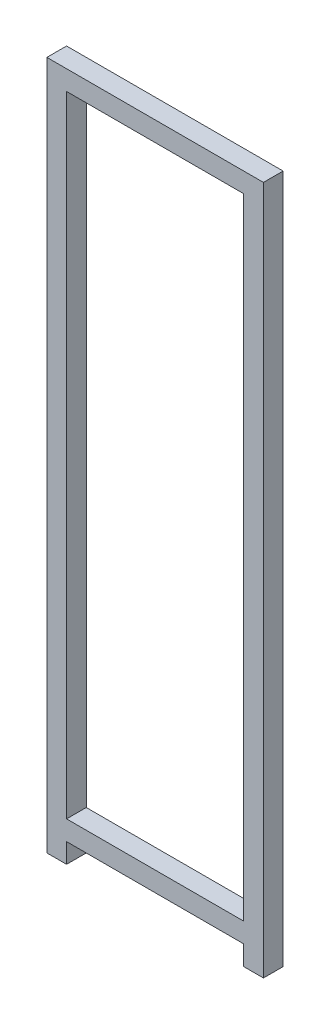
ISO-10303-21;
HEADER;
FILE_DESCRIPTION(('STEP AP214'),'2;1');
FILE_NAME('part.step','',(''),(''),'','','');
FILE_SCHEMA(('AUTOMOTIVE_DESIGN { 1 0 10303 214 1 1 1 1 }'));
ENDSEC;
DATA;
#1=APPLICATION_CONTEXT('core data for automotive mechanical design processes');
#2=APPLICATION_PROTOCOL_DEFINITION('international standard','automotive_design',2000,#1);
#3=PRODUCT_CONTEXT('',#1,'mechanical');
#4=PRODUCT('Part','Part','',(#3));
#5=PRODUCT_RELATED_PRODUCT_CATEGORY('part','',(#4));
#6=PRODUCT_DEFINITION_FORMATION('','',#4);
#7=PRODUCT_DEFINITION_CONTEXT('part definition',#1,'design');
#8=PRODUCT_DEFINITION('design','',#6,#7);
#9=PRODUCT_DEFINITION_SHAPE('','',#8);
#10=(LENGTH_UNIT() NAMED_UNIT(*) SI_UNIT(.MILLI.,.METRE.));
#11=(NAMED_UNIT(*) PLANE_ANGLE_UNIT() SI_UNIT($,.RADIAN.));
#12=(NAMED_UNIT(*) SI_UNIT($,.STERADIAN.) SOLID_ANGLE_UNIT());
#13=UNCERTAINTY_MEASURE_WITH_UNIT(LENGTH_MEASURE(1.E-05),#10,'distance_accuracy_value','');
#14=(GEOMETRIC_REPRESENTATION_CONTEXT(3) GLOBAL_UNCERTAINTY_ASSIGNED_CONTEXT((#13)) GLOBAL_UNIT_ASSIGNED_CONTEXT((#10,
#11,#12)) REPRESENTATION_CONTEXT('',''));
#15=CARTESIAN_POINT('',(0.,0.,0.));
#16=DIRECTION('',(0.,0.,1.));
#17=DIRECTION('',(1.,0.,0.));
#18=AXIS2_PLACEMENT_3D('',#15,#16,#17);
#19=CARTESIAN_POINT('',(-225.,-1500.,-50.));
#20=DIRECTION('',(0.,-1.,0.));
#21=DIRECTION('',(0.,0.,-1.));
#22=AXIS2_PLACEMENT_3D('',#19,#20,#21);
#23=PLANE('',#22);
#24=DIRECTION('',(1.,0.,0.));
#25=VECTOR('',#24,1.);
#26=CARTESIAN_POINT('',(-225.,-1500.,0.));
#27=LINE('',#26,#25);
#28=CARTESIAN_POINT('',(-275.,-1500.,0.));
#29=VERTEX_POINT('',#28);
#30=CARTESIAN_POINT('',(-225.,-1500.,0.));
#31=VERTEX_POINT('',#30);
#32=EDGE_CURVE('E182',#29,#31,#27,.T.);
#33=ORIENTED_EDGE('',*,*,#32,.F.);
#34=DIRECTION('',(0.,0.,1.));
#35=VECTOR('',#34,1.);
#36=CARTESIAN_POINT('',(-275.,-1500.,-50.));
#37=LINE('',#36,#35);
#38=CARTESIAN_POINT('',(-275.,-1500.,-50.));
#39=VERTEX_POINT('',#38);
#40=EDGE_CURVE('E11',#39,#29,#37,.T.);
#41=ORIENTED_EDGE('',*,*,#40,.F.);
#42=DIRECTION('',(1.,0.,0.));
#43=VECTOR('',#42,1.);
#44=CARTESIAN_POINT('',(-225.,-1500.,-50.));
#45=LINE('',#44,#43);
#46=CARTESIAN_POINT('',(-225.,-1500.,-50.));
#47=VERTEX_POINT('',#46);
#48=EDGE_CURVE('E188',#39,#47,#45,.T.);
#49=ORIENTED_EDGE('',*,*,#48,.T.);
#50=DIRECTION('',(0.,0.,1.));
#51=VECTOR('',#50,1.);
#52=CARTESIAN_POINT('',(-225.,-1500.,-50.));
#53=LINE('',#52,#51);
#54=EDGE_CURVE('E52',#47,#31,#53,.T.);
#55=ORIENTED_EDGE('',*,*,#54,.T.);
#56=EDGE_LOOP('',(#33,#41,#49,#55));
#57=FACE_BOUND('',#56,.T.);
#58=ADVANCED_FACE('F49',(#57),#23,.T.);
#59=CARTESIAN_POINT('',(-275.,-1500.,-50.));
#60=DIRECTION('',(-1.,0.,0.));
#61=DIRECTION('',(0.,0.,1.));
#62=AXIS2_PLACEMENT_3D('',#59,#60,#61);
#63=PLANE('',#62);
#64=DIRECTION('',(0.,-1.,0.));
#65=VECTOR('',#64,1.);
#66=CARTESIAN_POINT('',(-275.,-1500.,0.));
#67=LINE('',#66,#65);
#68=CARTESIAN_POINT('',(-275.,250.,0.));
#69=VERTEX_POINT('',#68);
#70=EDGE_CURVE('E193',#69,#29,#67,.T.);
#71=ORIENTED_EDGE('',*,*,#70,.F.);
#72=DIRECTION('',(0.,0.,1.));
#73=VECTOR('',#72,1.);
#74=CARTESIAN_POINT('',(-275.,250.,-50.));
#75=LINE('',#74,#73);
#76=CARTESIAN_POINT('',(-275.,250.,-50.));
#77=VERTEX_POINT('',#76);
#78=EDGE_CURVE('E58',#77,#69,#75,.T.);
#79=ORIENTED_EDGE('',*,*,#78,.F.);
#80=DIRECTION('',(0.,-1.,0.));
#81=VECTOR('',#80,1.);
#82=CARTESIAN_POINT('',(-275.,-1500.,-50.));
#83=LINE('',#82,#81);
#84=EDGE_CURVE('E217',#77,#39,#83,.T.);
#85=ORIENTED_EDGE('',*,*,#84,.T.);
#86=ORIENTED_EDGE('',*,*,#40,.T.);
#87=EDGE_LOOP('',(#71,#79,#85,#86));
#88=FACE_BOUND('',#87,.T.);
#89=ADVANCED_FACE('F280',(#88),#63,.T.);
#90=CARTESIAN_POINT('',(-275.,250.,-50.));
#91=DIRECTION('',(0.,1.,0.));
#92=DIRECTION('',(-1.,0.,0.));
#93=AXIS2_PLACEMENT_3D('',#90,#91,#92);
#94=PLANE('',#93);
#95=DIRECTION('',(-1.,0.,0.));
#96=VECTOR('',#95,1.);
#97=CARTESIAN_POINT('',(-275.,250.,0.));
#98=LINE('',#97,#96);
#99=CARTESIAN_POINT('',(275.,250.,0.));
#100=VERTEX_POINT('',#99);
#101=EDGE_CURVE('E244',#100,#69,#98,.T.);
#102=ORIENTED_EDGE('',*,*,#101,.F.);
#103=DIRECTION('',(0.,0.,1.));
#104=VECTOR('',#103,1.);
#105=CARTESIAN_POINT('',(275.,250.,-50.));
#106=LINE('',#105,#104);
#107=CARTESIAN_POINT('',(275.,250.,-50.));
#108=VERTEX_POINT('',#107);
#109=EDGE_CURVE('E253',#108,#100,#106,.T.);
#110=ORIENTED_EDGE('',*,*,#109,.F.);
#111=DIRECTION('',(-1.,0.,0.));
#112=VECTOR('',#111,1.);
#113=CARTESIAN_POINT('',(-275.,250.,-50.));
#114=LINE('',#113,#112);
#115=EDGE_CURVE('E213',#108,#77,#114,.T.);
#116=ORIENTED_EDGE('',*,*,#115,.T.);
#117=ORIENTED_EDGE('',*,*,#78,.T.);
#118=EDGE_LOOP('',(#102,#110,#116,#117));
#119=FACE_BOUND('',#118,.T.);
#120=ADVANCED_FACE('F299',(#119),#94,.T.);
#121=CARTESIAN_POINT('',(275.,250.,-50.));
#122=DIRECTION('',(1.,0.,0.));
#123=DIRECTION('',(0.,1.,0.));
#124=AXIS2_PLACEMENT_3D('',#121,#122,#123);
#125=PLANE('',#124);
#126=DIRECTION('',(0.,1.,0.));
#127=VECTOR('',#126,1.);
#128=CARTESIAN_POINT('',(275.,250.,0.));
#129=LINE('',#128,#127);
#130=CARTESIAN_POINT('',(275.,-1500.,0.));
#131=VERTEX_POINT('',#130);
#132=EDGE_CURVE('E240',#131,#100,#129,.T.);
#133=ORIENTED_EDGE('',*,*,#132,.F.);
#134=DIRECTION('',(0.,0.,1.));
#135=VECTOR('',#134,1.);
#136=CARTESIAN_POINT('',(275.,-1500.,-50.));
#137=LINE('',#136,#135);
#138=CARTESIAN_POINT('',(275.,-1500.,-50.));
#139=VERTEX_POINT('',#138);
#140=EDGE_CURVE('E256',#139,#131,#137,.T.);
#141=ORIENTED_EDGE('',*,*,#140,.F.);
#142=DIRECTION('',(0.,1.,0.));
#143=VECTOR('',#142,1.);
#144=CARTESIAN_POINT('',(275.,250.,-50.));
#145=LINE('',#144,#143);
#146=EDGE_CURVE('E209',#139,#108,#145,.T.);
#147=ORIENTED_EDGE('',*,*,#146,.T.);
#148=ORIENTED_EDGE('',*,*,#109,.T.);
#149=EDGE_LOOP('',(#133,#141,#147,#148));
#150=FACE_BOUND('',#149,.T.);
#151=ADVANCED_FACE('F297',(#150),#125,.T.);
#152=CARTESIAN_POINT('',(275.,-1500.,-50.));
#153=DIRECTION('',(0.,-1.,0.));
#154=DIRECTION('',(0.,0.,-1.));
#155=AXIS2_PLACEMENT_3D('',#152,#153,#154);
#156=PLANE('',#155);
#157=DIRECTION('',(1.,0.,0.));
#158=VECTOR('',#157,1.);
#159=CARTESIAN_POINT('',(275.,-1500.,0.));
#160=LINE('',#159,#158);
#161=CARTESIAN_POINT('',(225.,-1500.,0.));
#162=VERTEX_POINT('',#161);
#163=EDGE_CURVE('E236',#162,#131,#160,.T.);
#164=ORIENTED_EDGE('',*,*,#163,.F.);
#165=DIRECTION('',(0.,0.,1.));
#166=VECTOR('',#165,1.);
#167=CARTESIAN_POINT('',(225.,-1500.,-50.));
#168=LINE('',#167,#166);
#169=CARTESIAN_POINT('',(225.,-1500.,-50.));
#170=VERTEX_POINT('',#169);
#171=EDGE_CURVE('E259',#170,#162,#168,.T.);
#172=ORIENTED_EDGE('',*,*,#171,.F.);
#173=DIRECTION('',(1.,0.,0.));
#174=VECTOR('',#173,1.);
#175=CARTESIAN_POINT('',(275.,-1500.,-50.));
#176=LINE('',#175,#174);
#177=EDGE_CURVE('E205',#170,#139,#176,.T.);
#178=ORIENTED_EDGE('',*,*,#177,.T.);
#179=ORIENTED_EDGE('',*,*,#140,.T.);
#180=EDGE_LOOP('',(#164,#172,#178,#179));
#181=FACE_BOUND('',#180,.T.);
#182=ADVANCED_FACE('F293',(#181),#156,.T.);
#183=CARTESIAN_POINT('',(225.,-1500.,-50.));
#184=DIRECTION('',(-1.,0.,0.));
#185=DIRECTION('',(0.,0.,1.));
#186=AXIS2_PLACEMENT_3D('',#183,#184,#185);
#187=PLANE('',#186);
#188=DIRECTION('',(0.,-1.,0.));
#189=VECTOR('',#188,1.);
#190=CARTESIAN_POINT('',(225.,-1500.,0.));
#191=LINE('',#190,#189);
#192=CARTESIAN_POINT('',(225.,-1450.,0.));
#193=VERTEX_POINT('',#192);
#194=EDGE_CURVE('E232',#193,#162,#191,.T.);
#195=ORIENTED_EDGE('',*,*,#194,.F.);
#196=DIRECTION('',(0.,0.,1.));
#197=VECTOR('',#196,1.);
#198=CARTESIAN_POINT('',(225.,-1450.,-50.));
#199=LINE('',#198,#197);
#200=CARTESIAN_POINT('',(225.,-1450.,-50.));
#201=VERTEX_POINT('',#200);
#202=EDGE_CURVE('E262',#201,#193,#199,.T.);
#203=ORIENTED_EDGE('',*,*,#202,.F.);
#204=DIRECTION('',(0.,-1.,0.));
#205=VECTOR('',#204,1.);
#206=CARTESIAN_POINT('',(225.,-1500.,-50.));
#207=LINE('',#206,#205);
#208=EDGE_CURVE('E201',#201,#170,#207,.T.);
#209=ORIENTED_EDGE('',*,*,#208,.T.);
#210=ORIENTED_EDGE('',*,*,#171,.T.);
#211=EDGE_LOOP('',(#195,#203,#209,#210));
#212=FACE_BOUND('',#211,.T.);
#213=ADVANCED_FACE('F291',(#212),#187,.T.);
#214=CARTESIAN_POINT('',(-225.,-1450.,-50.));
#215=DIRECTION('',(0.,-1.,0.));
#216=DIRECTION('',(0.,0.,-1.));
#217=AXIS2_PLACEMENT_3D('',#214,#215,#216);
#218=PLANE('',#217);
#219=DIRECTION('',(1.,0.,0.));
#220=VECTOR('',#219,1.);
#221=CARTESIAN_POINT('',(-225.,-1450.,0.));
#222=LINE('',#221,#220);
#223=CARTESIAN_POINT('',(-225.,-1450.,0.));
#224=VERTEX_POINT('',#223);
#225=EDGE_CURVE('E228',#224,#193,#222,.T.);
#226=ORIENTED_EDGE('',*,*,#225,.F.);
#227=DIRECTION('',(0.,0.,1.));
#228=VECTOR('',#227,1.);
#229=CARTESIAN_POINT('',(-225.,-1450.,-50.));
#230=LINE('',#229,#228);
#231=CARTESIAN_POINT('',(-225.,-1450.,-50.));
#232=VERTEX_POINT('',#231);
#233=EDGE_CURVE('E264',#232,#224,#230,.T.);
#234=ORIENTED_EDGE('',*,*,#233,.F.);
#235=DIRECTION('',(1.,0.,0.));
#236=VECTOR('',#235,1.);
#237=CARTESIAN_POINT('',(-225.,-1450.,-50.));
#238=LINE('',#237,#236);
#239=EDGE_CURVE('E197',#232,#201,#238,.T.);
#240=ORIENTED_EDGE('',*,*,#239,.T.);
#241=ORIENTED_EDGE('',*,*,#202,.T.);
#242=EDGE_LOOP('',(#226,#234,#240,#241));
#243=FACE_BOUND('',#242,.T.);
#244=ADVANCED_FACE('F287',(#243),#218,.T.);
#245=CARTESIAN_POINT('',(-225.,-1450.,-50.));
#246=DIRECTION('',(1.,0.,0.));
#247=DIRECTION('',(0.,0.,-1.));
#248=AXIS2_PLACEMENT_3D('',#245,#246,#247);
#249=PLANE('',#248);
#250=DIRECTION('',(0.,1.,0.));
#251=VECTOR('',#250,1.);
#252=CARTESIAN_POINT('',(-225.,-1450.,0.));
#253=LINE('',#252,#251);
#254=EDGE_CURVE('E224',#31,#224,#253,.T.);
#255=ORIENTED_EDGE('',*,*,#254,.F.);
#256=ORIENTED_EDGE('',*,*,#54,.F.);
#257=DIRECTION('',(0.,1.,0.));
#258=VECTOR('',#257,1.);
#259=CARTESIAN_POINT('',(-225.,-1450.,-50.));
#260=LINE('',#259,#258);
#261=EDGE_CURVE('E192',#47,#232,#260,.T.);
#262=ORIENTED_EDGE('',*,*,#261,.T.);
#263=ORIENTED_EDGE('',*,*,#233,.T.);
#264=EDGE_LOOP('',(#255,#256,#262,#263));
#265=FACE_BOUND('',#264,.T.);
#266=ADVANCED_FACE('F274',(#265),#249,.T.);
#267=CARTESIAN_POINT('',(0.,0.,-50.));
#268=DIRECTION('',(0.,0.,-1.));
#269=DIRECTION('',(-1.,0.,0.));
#270=AXIS2_PLACEMENT_3D('',#267,#268,#269);
#271=PLANE('',#270);
#272=DIRECTION('',(0.,1.,0.));
#273=VECTOR('',#272,1.);
#274=CARTESIAN_POINT('',(225.,-1400.,-50.));
#275=LINE('',#274,#273);
#276=CARTESIAN_POINT('',(225.,-1400.,-50.));
#277=VERTEX_POINT('',#276);
#278=CARTESIAN_POINT('',(225.,200.,-50.));
#279=VERTEX_POINT('',#278);
#280=EDGE_CURVE('E141',#277,#279,#275,.T.);
#281=ORIENTED_EDGE('',*,*,#280,.T.);
#282=DIRECTION('',(-1.,0.,0.));
#283=VECTOR('',#282,1.);
#284=CARTESIAN_POINT('',(225.,200.,-50.));
#285=LINE('',#284,#283);
#286=CARTESIAN_POINT('',(-225.,200.,-50.));
#287=VERTEX_POINT('',#286);
#288=EDGE_CURVE('E151',#279,#287,#285,.T.);
#289=ORIENTED_EDGE('',*,*,#288,.T.);
#290=DIRECTION('',(0.,-1.,0.));
#291=VECTOR('',#290,1.);
#292=CARTESIAN_POINT('',(-225.,200.,-50.));
#293=LINE('',#292,#291);
#294=CARTESIAN_POINT('',(-225.,-1400.,-50.));
#295=VERTEX_POINT('',#294);
#296=EDGE_CURVE('E66',#287,#295,#293,.T.);
#297=ORIENTED_EDGE('',*,*,#296,.T.);
#298=DIRECTION('',(1.,0.,0.));
#299=VECTOR('',#298,1.);
#300=CARTESIAN_POINT('',(225.,-1400.,-50.));
#301=LINE('',#300,#299);
#302=EDGE_CURVE('E148',#295,#277,#301,.T.);
#303=ORIENTED_EDGE('',*,*,#302,.T.);
#304=EDGE_LOOP('',(#281,#289,#297,#303));
#305=FACE_BOUND('',#304,.T.);
#306=ORIENTED_EDGE('',*,*,#48,.F.);
#307=ORIENTED_EDGE('',*,*,#84,.F.);
#308=ORIENTED_EDGE('',*,*,#115,.F.);
#309=ORIENTED_EDGE('',*,*,#146,.F.);
#310=ORIENTED_EDGE('',*,*,#177,.F.);
#311=ORIENTED_EDGE('',*,*,#208,.F.);
#312=ORIENTED_EDGE('',*,*,#239,.F.);
#313=ORIENTED_EDGE('',*,*,#261,.F.);
#314=EDGE_LOOP('',(#306,#307,#308,#309,#310,#311,#312,#313));
#315=FACE_BOUND('',#314,.T.);
#316=ADVANCED_FACE('F156',(#305,#315),#271,.T.);
#317=CARTESIAN_POINT('',(0.,0.,0.));
#318=DIRECTION('',(0.,0.,-1.));
#319=DIRECTION('',(-1.,0.,0.));
#320=AXIS2_PLACEMENT_3D('',#317,#318,#319);
#321=PLANE('',#320);
#322=DIRECTION('',(-1.,0.,0.));
#323=VECTOR('',#322,1.);
#324=CARTESIAN_POINT('',(225.,200.,0.));
#325=LINE('',#324,#323);
#326=CARTESIAN_POINT('',(225.,200.,0.));
#327=VERTEX_POINT('',#326);
#328=CARTESIAN_POINT('',(-225.,200.,0.));
#329=VERTEX_POINT('',#328);
#330=EDGE_CURVE('E173',#327,#329,#325,.T.);
#331=ORIENTED_EDGE('',*,*,#330,.F.);
#332=DIRECTION('',(0.,1.,0.));
#333=VECTOR('',#332,1.);
#334=CARTESIAN_POINT('',(225.,-1400.,0.));
#335=LINE('',#334,#333);
#336=CARTESIAN_POINT('',(225.,-1400.,0.));
#337=VERTEX_POINT('',#336);
#338=EDGE_CURVE('E74',#337,#327,#335,.T.);
#339=ORIENTED_EDGE('',*,*,#338,.F.);
#340=DIRECTION('',(1.,0.,0.));
#341=VECTOR('',#340,1.);
#342=CARTESIAN_POINT('',(225.,-1400.,0.));
#343=LINE('',#342,#341);
#344=CARTESIAN_POINT('',(-225.,-1400.,0.));
#345=VERTEX_POINT('',#344);
#346=EDGE_CURVE('E160',#345,#337,#343,.T.);
#347=ORIENTED_EDGE('',*,*,#346,.F.);
#348=DIRECTION('',(0.,-1.,0.));
#349=VECTOR('',#348,1.);
#350=CARTESIAN_POINT('',(-225.,200.,0.));
#351=LINE('',#350,#349);
#352=EDGE_CURVE('E164',#329,#345,#351,.T.);
#353=ORIENTED_EDGE('',*,*,#352,.F.);
#354=EDGE_LOOP('',(#331,#339,#347,#353));
#355=FACE_BOUND('',#354,.T.);
#356=ORIENTED_EDGE('',*,*,#32,.T.);
#357=ORIENTED_EDGE('',*,*,#254,.T.);
#358=ORIENTED_EDGE('',*,*,#225,.T.);
#359=ORIENTED_EDGE('',*,*,#194,.T.);
#360=ORIENTED_EDGE('',*,*,#163,.T.);
#361=ORIENTED_EDGE('',*,*,#132,.T.);
#362=ORIENTED_EDGE('',*,*,#101,.T.);
#363=ORIENTED_EDGE('',*,*,#70,.T.);
#364=EDGE_LOOP('',(#356,#357,#358,#359,#360,#361,#362,#363));
#365=FACE_BOUND('',#364,.T.);
#366=ADVANCED_FACE('F276',(#355,#365),#321,.F.);
#367=CARTESIAN_POINT('',(225.,-1400.,-50.));
#368=DIRECTION('',(1.,0.,0.));
#369=DIRECTION('',(0.,0.,-1.));
#370=AXIS2_PLACEMENT_3D('',#367,#368,#369);
#371=PLANE('',#370);
#372=ORIENTED_EDGE('',*,*,#338,.T.);
#373=DIRECTION('',(0.,0.,1.));
#374=VECTOR('',#373,1.);
#375=CARTESIAN_POINT('',(225.,200.,-50.));
#376=LINE('',#375,#374);
#377=EDGE_CURVE('E137',#279,#327,#376,.T.);
#378=ORIENTED_EDGE('',*,*,#377,.F.);
#379=ORIENTED_EDGE('',*,*,#280,.F.);
#380=DIRECTION('',(0.,0.,1.));
#381=VECTOR('',#380,1.);
#382=CARTESIAN_POINT('',(225.,-1400.,-50.));
#383=LINE('',#382,#381);
#384=EDGE_CURVE('E179',#277,#337,#383,.T.);
#385=ORIENTED_EDGE('',*,*,#384,.T.);
#386=EDGE_LOOP('',(#372,#378,#379,#385));
#387=FACE_BOUND('',#386,.T.);
#388=ADVANCED_FACE('F139',(#387),#371,.F.);
#389=CARTESIAN_POINT('',(225.,-1400.,-50.));
#390=DIRECTION('',(0.,-1.,0.));
#391=DIRECTION('',(0.,0.,-1.));
#392=AXIS2_PLACEMENT_3D('',#389,#390,#391);
#393=PLANE('',#392);
#394=ORIENTED_EDGE('',*,*,#346,.T.);
#395=ORIENTED_EDGE('',*,*,#384,.F.);
#396=ORIENTED_EDGE('',*,*,#302,.F.);
#397=DIRECTION('',(0.,0.,1.));
#398=VECTOR('',#397,1.);
#399=CARTESIAN_POINT('',(-225.,-1400.,-50.));
#400=LINE('',#399,#398);
#401=EDGE_CURVE('E183',#295,#345,#400,.T.);
#402=ORIENTED_EDGE('',*,*,#401,.T.);
#403=EDGE_LOOP('',(#394,#395,#396,#402));
#404=FACE_BOUND('',#403,.T.);
#405=ADVANCED_FACE('F382',(#404),#393,.F.);
#406=CARTESIAN_POINT('',(-225.,200.,-50.));
#407=DIRECTION('',(-1.,0.,0.));
#408=DIRECTION('',(0.,0.,1.));
#409=AXIS2_PLACEMENT_3D('',#406,#407,#408);
#410=PLANE('',#409);
#411=ORIENTED_EDGE('',*,*,#352,.T.);
#412=ORIENTED_EDGE('',*,*,#401,.F.);
#413=ORIENTED_EDGE('',*,*,#296,.F.);
#414=DIRECTION('',(0.,0.,1.));
#415=VECTOR('',#414,1.);
#416=CARTESIAN_POINT('',(-225.,200.,-50.));
#417=LINE('',#416,#415);
#418=EDGE_CURVE('E147',#287,#329,#417,.T.);
#419=ORIENTED_EDGE('',*,*,#418,.T.);
#420=EDGE_LOOP('',(#411,#412,#413,#419));
#421=FACE_BOUND('',#420,.T.);
#422=ADVANCED_FACE('F391',(#421),#410,.F.);
#423=CARTESIAN_POINT('',(225.,200.,-50.));
#424=DIRECTION('',(0.,1.,0.));
#425=DIRECTION('',(0.,0.,1.));
#426=AXIS2_PLACEMENT_3D('',#423,#424,#425);
#427=PLANE('',#426);
#428=ORIENTED_EDGE('',*,*,#330,.T.);
#429=ORIENTED_EDGE('',*,*,#418,.F.);
#430=ORIENTED_EDGE('',*,*,#288,.F.);
#431=ORIENTED_EDGE('',*,*,#377,.T.);
#432=EDGE_LOOP('',(#428,#429,#430,#431));
#433=FACE_BOUND('',#432,.T.);
#434=ADVANCED_FACE('F152',(#433),#427,.F.);
#435=CLOSED_SHELL('',(#58,#89,#120,#151,#182,#213,#244,#266,#316,#366,#388,#405,#422,#434));
#436=MANIFOLD_SOLID_BREP('B2',#435);
#437=ADVANCED_BREP_SHAPE_REPRESENTATION('',(#18,#436),#14);
#438=SHAPE_DEFINITION_REPRESENTATION(#9,#437);
ENDSEC;
END-ISO-10303-21;
